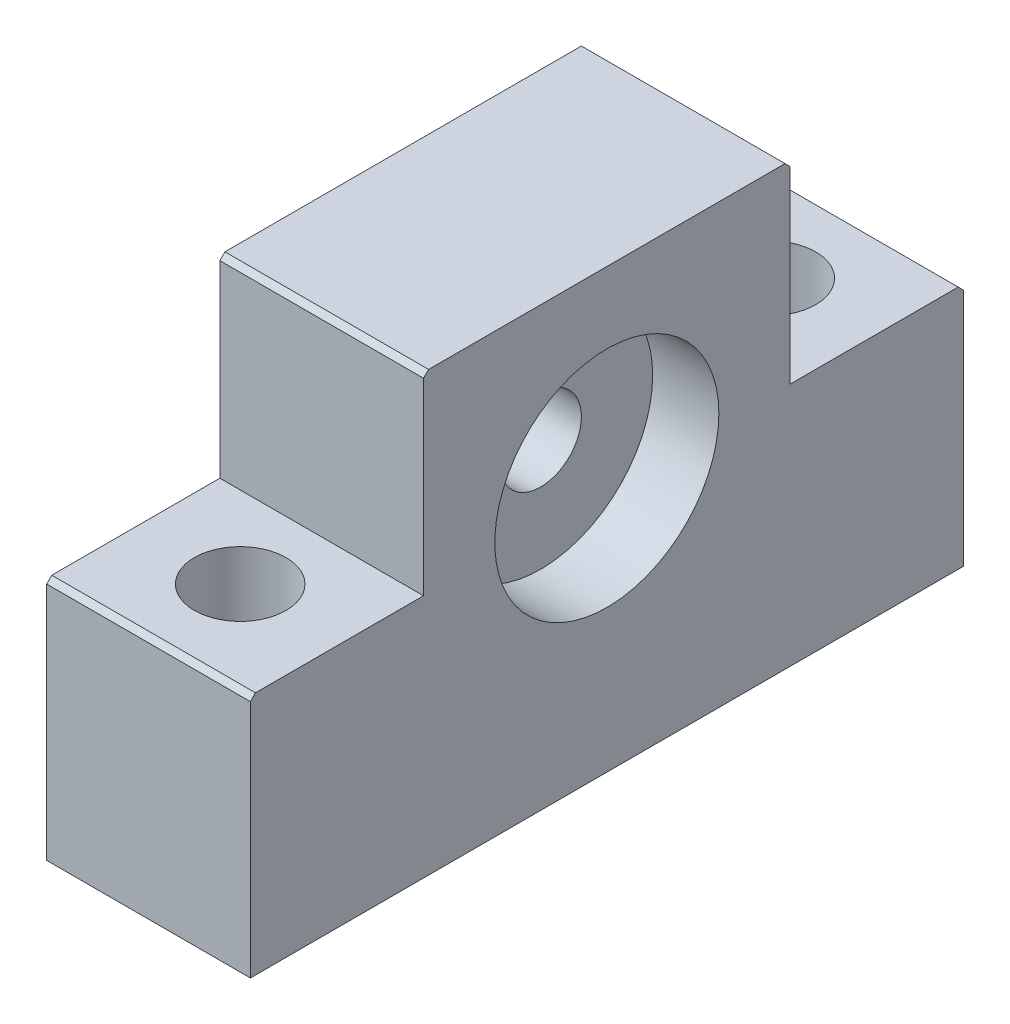
ISO-10303-21;
HEADER;
FILE_DESCRIPTION(('STEP AP214'),'2;1');
FILE_NAME('part.step','',(''),(''),'','','');
FILE_SCHEMA(('AUTOMOTIVE_DESIGN { 1 0 10303 214 1 1 1 1 }'));
ENDSEC;
DATA;
#1=APPLICATION_CONTEXT('core data for automotive mechanical design processes');
#2=APPLICATION_PROTOCOL_DEFINITION('international standard','automotive_design',2000,#1);
#3=PRODUCT_CONTEXT('',#1,'mechanical');
#4=PRODUCT('Part','Part','',(#3));
#5=PRODUCT_RELATED_PRODUCT_CATEGORY('part','',(#4));
#6=PRODUCT_DEFINITION_FORMATION('','',#4);
#7=PRODUCT_DEFINITION_CONTEXT('part definition',#1,'design');
#8=PRODUCT_DEFINITION('design','',#6,#7);
#9=PRODUCT_DEFINITION_SHAPE('','',#8);
#10=(LENGTH_UNIT() NAMED_UNIT(*) SI_UNIT(.MILLI.,.METRE.));
#11=(NAMED_UNIT(*) PLANE_ANGLE_UNIT() SI_UNIT($,.RADIAN.));
#12=(NAMED_UNIT(*) SI_UNIT($,.STERADIAN.) SOLID_ANGLE_UNIT());
#13=UNCERTAINTY_MEASURE_WITH_UNIT(LENGTH_MEASURE(1.E-05),#10,'distance_accuracy_value','');
#14=(GEOMETRIC_REPRESENTATION_CONTEXT(3) GLOBAL_UNCERTAINTY_ASSIGNED_CONTEXT((#13)) GLOBAL_UNIT_ASSIGNED_CONTEXT((#10,
#11,#12)) REPRESENTATION_CONTEXT('',''));
#15=CARTESIAN_POINT('',(0.,0.,0.));
#16=DIRECTION('',(0.,0.,1.));
#17=DIRECTION('',(1.,0.,0.));
#18=AXIS2_PLACEMENT_3D('',#15,#16,#17);
#19=CARTESIAN_POINT('',(20.,24.,18.0000000000001));
#20=DIRECTION('',(0.,-1.,0.));
#21=DIRECTION('',(0.,0.,-1.));
#22=AXIS2_PLACEMENT_3D('',#19,#20,#21);
#23=PLANE('',#22);
#24=CARTESIAN_POINT('',(10.,24.,26.));
#25=DIRECTION('',(0.,1.,0.));
#26=DIRECTION('',(0.,0.,1.));
#27=AXIS2_PLACEMENT_3D('',#24,#25,#26);
#28=CIRCLE('',#27,4.49999999999999);
#29=CARTESIAN_POINT('',(10.,24.,30.5));
#30=VERTEX_POINT('',#29);
#31=EDGE_CURVE('E271',#30,#30,#28,.T.);
#32=ORIENTED_EDGE('',*,*,#31,.F.);
#33=EDGE_LOOP('',(#32));
#34=FACE_BOUND('',#33,.T.);
#35=DIRECTION('',(0.,0.,1.));
#36=VECTOR('',#35,1.);
#37=CARTESIAN_POINT('',(0.,24.,18.0000000000001));
#38=LINE('',#37,#36);
#39=CARTESIAN_POINT('',(0.,24.,18.0000000000001));
#40=VERTEX_POINT('',#39);
#41=CARTESIAN_POINT('',(0.,24.,34.5));
#42=VERTEX_POINT('',#41);
#43=EDGE_CURVE('E162',#40,#42,#38,.T.);
#44=ORIENTED_EDGE('',*,*,#43,.T.);
#45=DIRECTION('',(-1.,0.,0.));
#46=VECTOR('',#45,1.);
#47=CARTESIAN_POINT('',(20.,24.,34.5));
#48=LINE('',#47,#46);
#49=CARTESIAN_POINT('',(20.,24.,34.5));
#50=VERTEX_POINT('',#49);
#51=EDGE_CURVE('E11',#50,#42,#48,.T.);
#52=ORIENTED_EDGE('',*,*,#51,.F.);
#53=DIRECTION('',(0.,0.,1.));
#54=VECTOR('',#53,1.);
#55=CARTESIAN_POINT('',(20.,24.,18.0000000000001));
#56=LINE('',#55,#54);
#57=CARTESIAN_POINT('',(20.,24.,18.0000000000001));
#58=VERTEX_POINT('',#57);
#59=EDGE_CURVE('E185',#58,#50,#56,.T.);
#60=ORIENTED_EDGE('',*,*,#59,.F.);
#61=DIRECTION('',(-1.,0.,0.));
#62=VECTOR('',#61,1.);
#63=CARTESIAN_POINT('',(20.,24.,18.0000000000001));
#64=LINE('',#63,#62);
#65=EDGE_CURVE('E158',#58,#40,#64,.T.);
#66=ORIENTED_EDGE('',*,*,#65,.T.);
#67=EDGE_LOOP('',(#44,#52,#60,#66));
#68=FACE_BOUND('',#67,.T.);
#69=ADVANCED_FACE('F42',(#34,#68),#23,.F.);
#70=CARTESIAN_POINT('',(20.,24.,34.5));
#71=DIRECTION('',(0.,-0.707106781186513,-0.707106781186582));
#72=DIRECTION('',(0.,0.707106781186582,-0.707106781186513));
#73=AXIS2_PLACEMENT_3D('',#70,#71,#72);
#74=PLANE('',#73);
#75=DIRECTION('',(0.,-0.707106781186582,0.707106781186513));
#76=VECTOR('',#75,1.);
#77=CARTESIAN_POINT('',(0.,24.,34.5));
#78=LINE('',#77,#76);
#79=CARTESIAN_POINT('',(0.,23.5,35.));
#80=VERTEX_POINT('',#79);
#81=EDGE_CURVE('E165',#42,#80,#78,.T.);
#82=ORIENTED_EDGE('',*,*,#81,.T.);
#83=DIRECTION('',(-1.,0.,0.));
#84=VECTOR('',#83,1.);
#85=CARTESIAN_POINT('',(20.,23.5,35.));
#86=LINE('',#85,#84);
#87=CARTESIAN_POINT('',(20.,23.5,35.));
#88=VERTEX_POINT('',#87);
#89=EDGE_CURVE('E50',#88,#80,#86,.T.);
#90=ORIENTED_EDGE('',*,*,#89,.F.);
#91=DIRECTION('',(0.,-0.707106781186582,0.707106781186513));
#92=VECTOR('',#91,1.);
#93=CARTESIAN_POINT('',(20.,24.,34.5));
#94=LINE('',#93,#92);
#95=EDGE_CURVE('E113',#50,#88,#94,.T.);
#96=ORIENTED_EDGE('',*,*,#95,.F.);
#97=ORIENTED_EDGE('',*,*,#51,.T.);
#98=EDGE_LOOP('',(#82,#90,#96,#97));
#99=FACE_BOUND('',#98,.T.);
#100=ADVANCED_FACE('F264',(#99),#74,.F.);
#101=CARTESIAN_POINT('',(20.,23.5,35.));
#102=DIRECTION('',(0.,0.,-1.));
#103=DIRECTION('',(0.,1.,0.));
#104=AXIS2_PLACEMENT_3D('',#101,#102,#103);
#105=PLANE('',#104);
#106=DIRECTION('',(0.,-1.,0.));
#107=VECTOR('',#106,1.);
#108=CARTESIAN_POINT('',(0.,23.5,35.));
#109=LINE('',#108,#107);
#110=CARTESIAN_POINT('',(0.,0.,35.));
#111=VERTEX_POINT('',#110);
#112=EDGE_CURVE('E168',#80,#111,#109,.T.);
#113=ORIENTED_EDGE('',*,*,#112,.T.);
#114=DIRECTION('',(-1.,0.,0.));
#115=VECTOR('',#114,1.);
#116=CARTESIAN_POINT('',(20.,0.,35.));
#117=LINE('',#116,#115);
#118=CARTESIAN_POINT('',(20.,0.,35.));
#119=VERTEX_POINT('',#118);
#120=EDGE_CURVE('E204',#119,#111,#117,.T.);
#121=ORIENTED_EDGE('',*,*,#120,.F.);
#122=DIRECTION('',(0.,-1.,0.));
#123=VECTOR('',#122,1.);
#124=CARTESIAN_POINT('',(20.,23.5,35.));
#125=LINE('',#124,#123);
#126=EDGE_CURVE('E212',#88,#119,#125,.T.);
#127=ORIENTED_EDGE('',*,*,#126,.F.);
#128=ORIENTED_EDGE('',*,*,#89,.T.);
#129=EDGE_LOOP('',(#113,#121,#127,#128));
#130=FACE_BOUND('',#129,.T.);
#131=ADVANCED_FACE('F210',(#130),#105,.F.);
#132=CARTESIAN_POINT('',(20.,0.,35.));
#133=DIRECTION('',(0.,1.,0.));
#134=DIRECTION('',(0.,0.,1.));
#135=AXIS2_PLACEMENT_3D('',#132,#133,#134);
#136=PLANE('',#135);
#137=CARTESIAN_POINT('',(10.,0.,26.));
#138=DIRECTION('',(0.,1.,0.));
#139=DIRECTION('',(0.,0.,1.));
#140=AXIS2_PLACEMENT_3D('',#137,#138,#139);
#141=CIRCLE('',#140,4.5);
#142=CARTESIAN_POINT('',(10.,0.,30.5));
#143=VERTEX_POINT('',#142);
#144=EDGE_CURVE('E273',#143,#143,#141,.T.);
#145=ORIENTED_EDGE('',*,*,#144,.T.);
#146=EDGE_LOOP('',(#145));
#147=FACE_BOUND('',#146,.T.);
#148=CARTESIAN_POINT('',(10.,0.,-26.));
#149=DIRECTION('',(0.,1.,0.));
#150=DIRECTION('',(0.,0.,1.));
#151=AXIS2_PLACEMENT_3D('',#148,#149,#150);
#152=CIRCLE('',#151,4.5);
#153=CARTESIAN_POINT('',(10.,0.,-21.5));
#154=VERTEX_POINT('',#153);
#155=EDGE_CURVE('E281',#154,#154,#152,.T.);
#156=ORIENTED_EDGE('',*,*,#155,.T.);
#157=EDGE_LOOP('',(#156));
#158=FACE_BOUND('',#157,.T.);
#159=DIRECTION('',(0.,0.,-1.));
#160=VECTOR('',#159,1.);
#161=CARTESIAN_POINT('',(0.,0.,35.));
#162=LINE('',#161,#160);
#163=CARTESIAN_POINT('',(0.,0.,-35.));
#164=VERTEX_POINT('',#163);
#165=EDGE_CURVE('E170',#111,#164,#162,.T.);
#166=ORIENTED_EDGE('',*,*,#165,.T.);
#167=DIRECTION('',(-1.,0.,0.));
#168=VECTOR('',#167,1.);
#169=CARTESIAN_POINT('',(20.,0.,-35.));
#170=LINE('',#169,#168);
#171=CARTESIAN_POINT('',(20.,0.,-35.));
#172=VERTEX_POINT('',#171);
#173=EDGE_CURVE('E201',#172,#164,#170,.T.);
#174=ORIENTED_EDGE('',*,*,#173,.F.);
#175=DIRECTION('',(0.,0.,-1.));
#176=VECTOR('',#175,1.);
#177=CARTESIAN_POINT('',(20.,0.,35.));
#178=LINE('',#177,#176);
#179=EDGE_CURVE('E230',#119,#172,#178,.T.);
#180=ORIENTED_EDGE('',*,*,#179,.F.);
#181=ORIENTED_EDGE('',*,*,#120,.T.);
#182=EDGE_LOOP('',(#166,#174,#180,#181));
#183=FACE_BOUND('',#182,.T.);
#184=ADVANCED_FACE('F221',(#147,#158,#183),#136,.F.);
#185=CARTESIAN_POINT('',(20.,23.5,-35.));
#186=DIRECTION('',(0.,0.,1.));
#187=DIRECTION('',(0.,-1.,0.));
#188=AXIS2_PLACEMENT_3D('',#185,#186,#187);
#189=PLANE('',#188);
#190=DIRECTION('',(0.,1.,0.));
#191=VECTOR('',#190,1.);
#192=CARTESIAN_POINT('',(0.,23.5,-35.));
#193=LINE('',#192,#191);
#194=CARTESIAN_POINT('',(0.,23.5,-35.));
#195=VERTEX_POINT('',#194);
#196=EDGE_CURVE('E172',#164,#195,#193,.T.);
#197=ORIENTED_EDGE('',*,*,#196,.T.);
#198=DIRECTION('',(-1.,0.,0.));
#199=VECTOR('',#198,1.);
#200=CARTESIAN_POINT('',(20.,23.5,-35.));
#201=LINE('',#200,#199);
#202=CARTESIAN_POINT('',(20.,23.5,-35.));
#203=VERTEX_POINT('',#202);
#204=EDGE_CURVE('E198',#203,#195,#201,.T.);
#205=ORIENTED_EDGE('',*,*,#204,.F.);
#206=DIRECTION('',(0.,1.,0.));
#207=VECTOR('',#206,1.);
#208=CARTESIAN_POINT('',(20.,23.5,-35.));
#209=LINE('',#208,#207);
#210=EDGE_CURVE('E227',#172,#203,#209,.T.);
#211=ORIENTED_EDGE('',*,*,#210,.F.);
#212=ORIENTED_EDGE('',*,*,#173,.T.);
#213=EDGE_LOOP('',(#197,#205,#211,#212));
#214=FACE_BOUND('',#213,.T.);
#215=ADVANCED_FACE('F225',(#214),#189,.F.);
#216=CARTESIAN_POINT('',(20.,24.,-34.5));
#217=DIRECTION('',(0.,-0.707106781186533,0.707106781186562));
#218=DIRECTION('',(0.,-0.707106781186562,-0.707106781186533));
#219=AXIS2_PLACEMENT_3D('',#216,#217,#218);
#220=PLANE('',#219);
#221=DIRECTION('',(0.,0.707106781186562,0.707106781186533));
#222=VECTOR('',#221,1.);
#223=CARTESIAN_POINT('',(0.,24.,-34.5));
#224=LINE('',#223,#222);
#225=CARTESIAN_POINT('',(0.,24.,-34.5));
#226=VERTEX_POINT('',#225);
#227=EDGE_CURVE('E174',#195,#226,#224,.T.);
#228=ORIENTED_EDGE('',*,*,#227,.T.);
#229=DIRECTION('',(-1.,0.,0.));
#230=VECTOR('',#229,1.);
#231=CARTESIAN_POINT('',(20.,24.,-34.5));
#232=LINE('',#231,#230);
#233=CARTESIAN_POINT('',(20.,24.,-34.5));
#234=VERTEX_POINT('',#233);
#235=EDGE_CURVE('E195',#234,#226,#232,.T.);
#236=ORIENTED_EDGE('',*,*,#235,.F.);
#237=DIRECTION('',(0.,0.707106781186562,0.707106781186533));
#238=VECTOR('',#237,1.);
#239=CARTESIAN_POINT('',(20.,24.,-34.5));
#240=LINE('',#239,#238);
#241=EDGE_CURVE('E229',#203,#234,#240,.T.);
#242=ORIENTED_EDGE('',*,*,#241,.F.);
#243=ORIENTED_EDGE('',*,*,#204,.T.);
#244=EDGE_LOOP('',(#228,#236,#242,#243));
#245=FACE_BOUND('',#244,.T.);
#246=ADVANCED_FACE('F400',(#245),#220,.F.);
#247=CARTESIAN_POINT('',(20.,24.,-17.9999999999999));
#248=DIRECTION('',(0.,-1.,0.));
#249=DIRECTION('',(0.,0.,-1.));
#250=AXIS2_PLACEMENT_3D('',#247,#248,#249);
#251=PLANE('',#250);
#252=CARTESIAN_POINT('',(10.,24.,-26.));
#253=DIRECTION('',(0.,1.,0.));
#254=DIRECTION('',(0.,0.,1.));
#255=AXIS2_PLACEMENT_3D('',#252,#253,#254);
#256=CIRCLE('',#255,4.49999999999999);
#257=CARTESIAN_POINT('',(10.,24.,-21.5));
#258=VERTEX_POINT('',#257);
#259=EDGE_CURVE('E276',#258,#258,#256,.T.);
#260=ORIENTED_EDGE('',*,*,#259,.F.);
#261=EDGE_LOOP('',(#260));
#262=FACE_BOUND('',#261,.T.);
#263=DIRECTION('',(0.,0.,1.));
#264=VECTOR('',#263,1.);
#265=CARTESIAN_POINT('',(0.,24.,-17.9999999999999));
#266=LINE('',#265,#264);
#267=CARTESIAN_POINT('',(0.,24.,-17.9999999999999));
#268=VERTEX_POINT('',#267);
#269=EDGE_CURVE('E176',#226,#268,#266,.T.);
#270=ORIENTED_EDGE('',*,*,#269,.T.);
#271=DIRECTION('',(-1.,0.,0.));
#272=VECTOR('',#271,1.);
#273=CARTESIAN_POINT('',(20.,24.,-17.9999999999999));
#274=LINE('',#273,#272);
#275=CARTESIAN_POINT('',(20.,24.,-17.9999999999999));
#276=VERTEX_POINT('',#275);
#277=EDGE_CURVE('E192',#276,#268,#274,.T.);
#278=ORIENTED_EDGE('',*,*,#277,.F.);
#279=DIRECTION('',(0.,0.,1.));
#280=VECTOR('',#279,1.);
#281=CARTESIAN_POINT('',(20.,24.,-17.9999999999999));
#282=LINE('',#281,#280);
#283=EDGE_CURVE('E232',#234,#276,#282,.T.);
#284=ORIENTED_EDGE('',*,*,#283,.F.);
#285=ORIENTED_EDGE('',*,*,#235,.T.);
#286=EDGE_LOOP('',(#270,#278,#284,#285));
#287=FACE_BOUND('',#286,.T.);
#288=ADVANCED_FACE('F395',(#262,#287),#251,.F.);
#289=CARTESIAN_POINT('',(20.,42.5,-17.9999999999999));
#290=DIRECTION('',(0.,0.,1.));
#291=DIRECTION('',(0.,-1.,0.));
#292=AXIS2_PLACEMENT_3D('',#289,#290,#291);
#293=PLANE('',#292);
#294=DIRECTION('',(0.,1.,0.));
#295=VECTOR('',#294,1.);
#296=CARTESIAN_POINT('',(0.,42.5,-17.9999999999999));
#297=LINE('',#296,#295);
#298=CARTESIAN_POINT('',(0.,42.5,-17.9999999999999));
#299=VERTEX_POINT('',#298);
#300=EDGE_CURVE('E178',#268,#299,#297,.T.);
#301=ORIENTED_EDGE('',*,*,#300,.T.);
#302=DIRECTION('',(-1.,0.,0.));
#303=VECTOR('',#302,1.);
#304=CARTESIAN_POINT('',(20.,42.5,-17.9999999999999));
#305=LINE('',#304,#303);
#306=CARTESIAN_POINT('',(20.,42.5,-17.9999999999999));
#307=VERTEX_POINT('',#306);
#308=EDGE_CURVE('E189',#307,#299,#305,.T.);
#309=ORIENTED_EDGE('',*,*,#308,.F.);
#310=DIRECTION('',(0.,1.,0.));
#311=VECTOR('',#310,1.);
#312=CARTESIAN_POINT('',(20.,42.5,-17.9999999999999));
#313=LINE('',#312,#311);
#314=EDGE_CURVE('E238',#276,#307,#313,.T.);
#315=ORIENTED_EDGE('',*,*,#314,.F.);
#316=ORIENTED_EDGE('',*,*,#277,.T.);
#317=EDGE_LOOP('',(#301,#309,#315,#316));
#318=FACE_BOUND('',#317,.T.);
#319=ADVANCED_FACE('F244',(#318),#293,.F.);
#320=CARTESIAN_POINT('',(20.,43.,-17.4999999999999));
#321=DIRECTION('',(0.,-0.707106781186545,0.70710678118655));
#322=DIRECTION('',(0.,-0.70710678118655,-0.707106781186545));
#323=AXIS2_PLACEMENT_3D('',#320,#321,#322);
#324=PLANE('',#323);
#325=DIRECTION('',(0.,0.70710678118655,0.707106781186545));
#326=VECTOR('',#325,1.);
#327=CARTESIAN_POINT('',(0.,43.,-17.4999999999999));
#328=LINE('',#327,#326);
#329=CARTESIAN_POINT('',(0.,43.,-17.4999999999999));
#330=VERTEX_POINT('',#329);
#331=EDGE_CURVE('E180',#299,#330,#328,.T.);
#332=ORIENTED_EDGE('',*,*,#331,.T.);
#333=DIRECTION('',(-1.,0.,0.));
#334=VECTOR('',#333,1.);
#335=CARTESIAN_POINT('',(20.,43.,-17.4999999999999));
#336=LINE('',#335,#334);
#337=CARTESIAN_POINT('',(20.,43.,-17.4999999999999));
#338=VERTEX_POINT('',#337);
#339=EDGE_CURVE('E153',#338,#330,#336,.T.);
#340=ORIENTED_EDGE('',*,*,#339,.F.);
#341=DIRECTION('',(0.,0.70710678118655,0.707106781186545));
#342=VECTOR('',#341,1.);
#343=CARTESIAN_POINT('',(20.,43.,-17.4999999999999));
#344=LINE('',#343,#342);
#345=EDGE_CURVE('E144',#307,#338,#344,.T.);
#346=ORIENTED_EDGE('',*,*,#345,.F.);
#347=ORIENTED_EDGE('',*,*,#308,.T.);
#348=EDGE_LOOP('',(#332,#340,#346,#347));
#349=FACE_BOUND('',#348,.T.);
#350=ADVANCED_FACE('F248',(#349),#324,.F.);
#351=CARTESIAN_POINT('',(20.,43.,17.5));
#352=DIRECTION('',(0.,-1.,0.));
#353=DIRECTION('',(0.,0.,-1.));
#354=AXIS2_PLACEMENT_3D('',#351,#352,#353);
#355=PLANE('',#354);
#356=DIRECTION('',(0.,0.,1.));
#357=VECTOR('',#356,1.);
#358=CARTESIAN_POINT('',(0.,43.,17.5));
#359=LINE('',#358,#357);
#360=CARTESIAN_POINT('',(0.,43.,17.5));
#361=VERTEX_POINT('',#360);
#362=EDGE_CURVE('E152',#330,#361,#359,.T.);
#363=ORIENTED_EDGE('',*,*,#362,.T.);
#364=DIRECTION('',(-1.,0.,0.));
#365=VECTOR('',#364,1.);
#366=CARTESIAN_POINT('',(20.,43.,17.5));
#367=LINE('',#366,#365);
#368=CARTESIAN_POINT('',(20.,43.,17.5));
#369=VERTEX_POINT('',#368);
#370=EDGE_CURVE('E149',#369,#361,#367,.T.);
#371=ORIENTED_EDGE('',*,*,#370,.F.);
#372=DIRECTION('',(0.,0.,1.));
#373=VECTOR('',#372,1.);
#374=CARTESIAN_POINT('',(20.,43.,17.5));
#375=LINE('',#374,#373);
#376=EDGE_CURVE('E138',#338,#369,#375,.T.);
#377=ORIENTED_EDGE('',*,*,#376,.F.);
#378=ORIENTED_EDGE('',*,*,#339,.T.);
#379=EDGE_LOOP('',(#363,#371,#377,#378));
#380=FACE_BOUND('',#379,.T.);
#381=ADVANCED_FACE('F150',(#380),#355,.F.);
#382=CARTESIAN_POINT('',(20.,42.5,18.0000000000001));
#383=DIRECTION('',(0.,-0.707106781186552,-0.707106781186543));
#384=DIRECTION('',(0.,0.707106781186543,-0.707106781186552));
#385=AXIS2_PLACEMENT_3D('',#382,#383,#384);
#386=PLANE('',#385);
#387=DIRECTION('',(0.,-0.707106781186543,0.707106781186552));
#388=VECTOR('',#387,1.);
#389=CARTESIAN_POINT('',(0.,42.5,18.0000000000001));
#390=LINE('',#389,#388);
#391=CARTESIAN_POINT('',(0.,42.5,18.0000000000001));
#392=VERTEX_POINT('',#391);
#393=EDGE_CURVE('E99',#361,#392,#390,.T.);
#394=ORIENTED_EDGE('',*,*,#393,.T.);
#395=DIRECTION('',(-1.,0.,0.));
#396=VECTOR('',#395,1.);
#397=CARTESIAN_POINT('',(20.,42.5,18.0000000000001));
#398=LINE('',#397,#396);
#399=CARTESIAN_POINT('',(20.,42.5,18.0000000000001));
#400=VERTEX_POINT('',#399);
#401=EDGE_CURVE('E154',#400,#392,#398,.T.);
#402=ORIENTED_EDGE('',*,*,#401,.F.);
#403=DIRECTION('',(0.,-0.707106781186543,0.707106781186552));
#404=VECTOR('',#403,1.);
#405=CARTESIAN_POINT('',(20.,42.5,18.0000000000001));
#406=LINE('',#405,#404);
#407=EDGE_CURVE('E142',#369,#400,#406,.T.);
#408=ORIENTED_EDGE('',*,*,#407,.F.);
#409=ORIENTED_EDGE('',*,*,#370,.T.);
#410=EDGE_LOOP('',(#394,#402,#408,#409));
#411=FACE_BOUND('',#410,.T.);
#412=ADVANCED_FACE('F156',(#411),#386,.F.);
#413=CARTESIAN_POINT('',(20.,42.5,18.0000000000001));
#414=DIRECTION('',(0.,0.,-1.));
#415=DIRECTION('',(0.,1.,0.));
#416=AXIS2_PLACEMENT_3D('',#413,#414,#415);
#417=PLANE('',#416);
#418=DIRECTION('',(0.,-1.,0.));
#419=VECTOR('',#418,1.);
#420=CARTESIAN_POINT('',(0.,42.5,18.0000000000001));
#421=LINE('',#420,#419);
#422=EDGE_CURVE('E105',#392,#40,#421,.T.);
#423=ORIENTED_EDGE('',*,*,#422,.T.);
#424=ORIENTED_EDGE('',*,*,#65,.F.);
#425=DIRECTION('',(0.,-1.,0.));
#426=VECTOR('',#425,1.);
#427=CARTESIAN_POINT('',(20.,42.5,18.0000000000001));
#428=LINE('',#427,#426);
#429=EDGE_CURVE('E58',#400,#58,#428,.T.);
#430=ORIENTED_EDGE('',*,*,#429,.F.);
#431=ORIENTED_EDGE('',*,*,#401,.T.);
#432=EDGE_LOOP('',(#423,#424,#430,#431));
#433=FACE_BOUND('',#432,.T.);
#434=ADVANCED_FACE('F252',(#433),#417,.F.);
#435=CARTESIAN_POINT('',(20.,0.,0.));
#436=DIRECTION('',(1.,0.,0.));
#437=DIRECTION('',(0.,0.,-1.));
#438=AXIS2_PLACEMENT_3D('',#435,#436,#437);
#439=PLANE('',#438);
#440=CARTESIAN_POINT('',(20.,25.,0.));
#441=DIRECTION('',(1.,0.,0.));
#442=DIRECTION('',(0.,0.,-1.));
#443=AXIS2_PLACEMENT_3D('',#440,#441,#442);
#444=CIRCLE('',#443,11.);
#445=CARTESIAN_POINT('',(20.,25.,-11.));
#446=VERTEX_POINT('',#445);
#447=EDGE_CURVE('E284',#446,#446,#444,.T.);
#448=ORIENTED_EDGE('',*,*,#447,.F.);
#449=EDGE_LOOP('',(#448));
#450=FACE_BOUND('',#449,.T.);
#451=ORIENTED_EDGE('',*,*,#59,.T.);
#452=ORIENTED_EDGE('',*,*,#95,.T.);
#453=ORIENTED_EDGE('',*,*,#126,.T.);
#454=ORIENTED_EDGE('',*,*,#179,.T.);
#455=ORIENTED_EDGE('',*,*,#210,.T.);
#456=ORIENTED_EDGE('',*,*,#241,.T.);
#457=ORIENTED_EDGE('',*,*,#283,.T.);
#458=ORIENTED_EDGE('',*,*,#314,.T.);
#459=ORIENTED_EDGE('',*,*,#345,.T.);
#460=ORIENTED_EDGE('',*,*,#376,.T.);
#461=ORIENTED_EDGE('',*,*,#407,.T.);
#462=ORIENTED_EDGE('',*,*,#429,.T.);
#463=EDGE_LOOP('',(#451,#452,#453,#454,#455,#456,#457,#458,#459,#460,#461,#462));
#464=FACE_BOUND('',#463,.T.);
#465=ADVANCED_FACE('F140',(#450,#464),#439,.T.);
#466=CARTESIAN_POINT('',(0.,0.,0.));
#467=DIRECTION('',(1.,0.,0.));
#468=DIRECTION('',(0.,0.,-1.));
#469=AXIS2_PLACEMENT_3D('',#466,#467,#468);
#470=PLANE('',#469);
#471=CARTESIAN_POINT('',(0.,25.,0.));
#472=DIRECTION('',(1.,0.,0.));
#473=DIRECTION('',(0.,0.,-1.));
#474=AXIS2_PLACEMENT_3D('',#471,#472,#473);
#475=CIRCLE('',#474,11.);
#476=CARTESIAN_POINT('',(0.,25.,-11.));
#477=VERTEX_POINT('',#476);
#478=EDGE_CURVE('E166',#477,#477,#475,.T.);
#479=ORIENTED_EDGE('',*,*,#478,.T.);
#480=EDGE_LOOP('',(#479));
#481=FACE_BOUND('',#480,.T.);
#482=ORIENTED_EDGE('',*,*,#43,.F.);
#483=ORIENTED_EDGE('',*,*,#422,.F.);
#484=ORIENTED_EDGE('',*,*,#393,.F.);
#485=ORIENTED_EDGE('',*,*,#362,.F.);
#486=ORIENTED_EDGE('',*,*,#331,.F.);
#487=ORIENTED_EDGE('',*,*,#300,.F.);
#488=ORIENTED_EDGE('',*,*,#269,.F.);
#489=ORIENTED_EDGE('',*,*,#227,.F.);
#490=ORIENTED_EDGE('',*,*,#196,.F.);
#491=ORIENTED_EDGE('',*,*,#165,.F.);
#492=ORIENTED_EDGE('',*,*,#112,.F.);
#493=ORIENTED_EDGE('',*,*,#81,.F.);
#494=EDGE_LOOP('',(#482,#483,#484,#485,#486,#487,#488,#489,#490,#491,#492,#493));
#495=FACE_BOUND('',#494,.T.);
#496=ADVANCED_FACE('F216',(#481,#495),#470,.F.);
#497=CARTESIAN_POINT('',(20.,25.,0.));
#498=DIRECTION('',(1.,0.,0.));
#499=DIRECTION('',(0.,0.,-1.));
#500=AXIS2_PLACEMENT_3D('',#497,#498,#499);
#501=CYLINDRICAL_SURFACE('',#500,11.);
#502=ORIENTED_EDGE('',*,*,#478,.F.);
#503=EDGE_LOOP('',(#502));
#504=FACE_BOUND('',#503,.T.);
#505=CARTESIAN_POINT('',(6.5,25.,0.));
#506=DIRECTION('',(1.,0.,0.));
#507=DIRECTION('',(0.,0.,-1.));
#508=AXIS2_PLACEMENT_3D('',#505,#506,#507);
#509=CIRCLE('',#508,11.);
#510=CARTESIAN_POINT('',(6.5,25.,-11.));
#511=VERTEX_POINT('',#510);
#512=EDGE_CURVE('E296',#511,#511,#509,.T.);
#513=ORIENTED_EDGE('',*,*,#512,.T.);
#514=EDGE_LOOP('',(#513));
#515=FACE_BOUND('',#514,.T.);
#516=ADVANCED_FACE('F305',(#504,#515),#501,.F.);
#517=CARTESIAN_POINT('',(6.5,36.,0.));
#518=DIRECTION('',(1.,0.,0.));
#519=DIRECTION('',(0.,0.,-1.));
#520=AXIS2_PLACEMENT_3D('',#517,#518,#519);
#521=PLANE('',#520);
#522=ORIENTED_EDGE('',*,*,#512,.F.);
#523=EDGE_LOOP('',(#522));
#524=FACE_BOUND('',#523,.T.);
#525=CARTESIAN_POINT('',(6.5,25.,0.));
#526=DIRECTION('',(1.,0.,0.));
#527=DIRECTION('',(0.,0.,-1.));
#528=AXIS2_PLACEMENT_3D('',#525,#526,#527);
#529=CIRCLE('',#528,4.);
#530=CARTESIAN_POINT('',(6.5,25.,-4.));
#531=VERTEX_POINT('',#530);
#532=EDGE_CURVE('E293',#531,#531,#529,.T.);
#533=ORIENTED_EDGE('',*,*,#532,.T.);
#534=EDGE_LOOP('',(#533));
#535=FACE_BOUND('',#534,.T.);
#536=ADVANCED_FACE('F308',(#524,#535),#521,.F.);
#537=CARTESIAN_POINT('',(20.,25.,0.));
#538=DIRECTION('',(1.,0.,0.));
#539=DIRECTION('',(0.,0.,-1.));
#540=AXIS2_PLACEMENT_3D('',#537,#538,#539);
#541=CYLINDRICAL_SURFACE('',#540,4.);
#542=ORIENTED_EDGE('',*,*,#532,.F.);
#543=EDGE_LOOP('',(#542));
#544=FACE_BOUND('',#543,.T.);
#545=CARTESIAN_POINT('',(13.5,25.,0.));
#546=DIRECTION('',(1.,0.,0.));
#547=DIRECTION('',(0.,0.,-1.));
#548=AXIS2_PLACEMENT_3D('',#545,#546,#547);
#549=CIRCLE('',#548,4.);
#550=CARTESIAN_POINT('',(13.5,25.,-4.));
#551=VERTEX_POINT('',#550);
#552=EDGE_CURVE('E290',#551,#551,#549,.T.);
#553=ORIENTED_EDGE('',*,*,#552,.T.);
#554=EDGE_LOOP('',(#553));
#555=FACE_BOUND('',#554,.T.);
#556=ADVANCED_FACE('F314',(#544,#555),#541,.F.);
#557=CARTESIAN_POINT('',(13.5,29.,0.));
#558=DIRECTION('',(-1.,0.,0.));
#559=DIRECTION('',(0.,0.,1.));
#560=AXIS2_PLACEMENT_3D('',#557,#558,#559);
#561=PLANE('',#560);
#562=ORIENTED_EDGE('',*,*,#552,.F.);
#563=EDGE_LOOP('',(#562));
#564=FACE_BOUND('',#563,.T.);
#565=CARTESIAN_POINT('',(13.5,25.,0.));
#566=DIRECTION('',(1.,0.,0.));
#567=DIRECTION('',(0.,0.,-1.));
#568=AXIS2_PLACEMENT_3D('',#565,#566,#567);
#569=CIRCLE('',#568,11.);
#570=CARTESIAN_POINT('',(13.5,25.,-11.));
#571=VERTEX_POINT('',#570);
#572=EDGE_CURVE('E287',#571,#571,#569,.T.);
#573=ORIENTED_EDGE('',*,*,#572,.T.);
#574=EDGE_LOOP('',(#573));
#575=FACE_BOUND('',#574,.T.);
#576=ADVANCED_FACE('F320',(#564,#575),#561,.F.);
#577=CARTESIAN_POINT('',(20.,25.,0.));
#578=DIRECTION('',(1.,0.,0.));
#579=DIRECTION('',(0.,0.,-1.));
#580=AXIS2_PLACEMENT_3D('',#577,#578,#579);
#581=CYLINDRICAL_SURFACE('',#580,11.);
#582=ORIENTED_EDGE('',*,*,#572,.F.);
#583=EDGE_LOOP('',(#582));
#584=FACE_BOUND('',#583,.T.);
#585=ORIENTED_EDGE('',*,*,#447,.T.);
#586=EDGE_LOOP('',(#585));
#587=FACE_BOUND('',#586,.T.);
#588=ADVANCED_FACE('F326',(#584,#587),#581,.F.);
#589=CARTESIAN_POINT('',(10.,24.,-26.));
#590=DIRECTION('',(0.,1.,0.));
#591=DIRECTION('',(0.,0.,1.));
#592=AXIS2_PLACEMENT_3D('',#589,#590,#591);
#593=CYLINDRICAL_SURFACE('',#592,4.49999999999999);
#594=ORIENTED_EDGE('',*,*,#155,.F.);
#595=EDGE_LOOP('',(#594));
#596=FACE_BOUND('',#595,.T.);
#597=ORIENTED_EDGE('',*,*,#259,.T.);
#598=EDGE_LOOP('',(#597));
#599=FACE_BOUND('',#598,.T.);
#600=ADVANCED_FACE('F332',(#596,#599),#593,.F.);
#601=CARTESIAN_POINT('',(10.,24.,26.));
#602=DIRECTION('',(0.,1.,0.));
#603=DIRECTION('',(0.,0.,1.));
#604=AXIS2_PLACEMENT_3D('',#601,#602,#603);
#605=CYLINDRICAL_SURFACE('',#604,4.49999999999999);
#606=ORIENTED_EDGE('',*,*,#144,.F.);
#607=EDGE_LOOP('',(#606));
#608=FACE_BOUND('',#607,.T.);
#609=ORIENTED_EDGE('',*,*,#31,.T.);
#610=EDGE_LOOP('',(#609));
#611=FACE_BOUND('',#610,.T.);
#612=ADVANCED_FACE('F338',(#608,#611),#605,.F.);
#613=CLOSED_SHELL('',(#69,#100,#131,#184,#215,#246,#288,#319,#350,#381,#412,#434,#465,#496,#516,
#536,#556,#576,#588,#600,#612));
#614=MANIFOLD_SOLID_BREP('B2',#613);
#615=ADVANCED_BREP_SHAPE_REPRESENTATION('',(#18,#614),#14);
#616=SHAPE_DEFINITION_REPRESENTATION(#9,#615);
ENDSEC;
END-ISO-10303-21;
